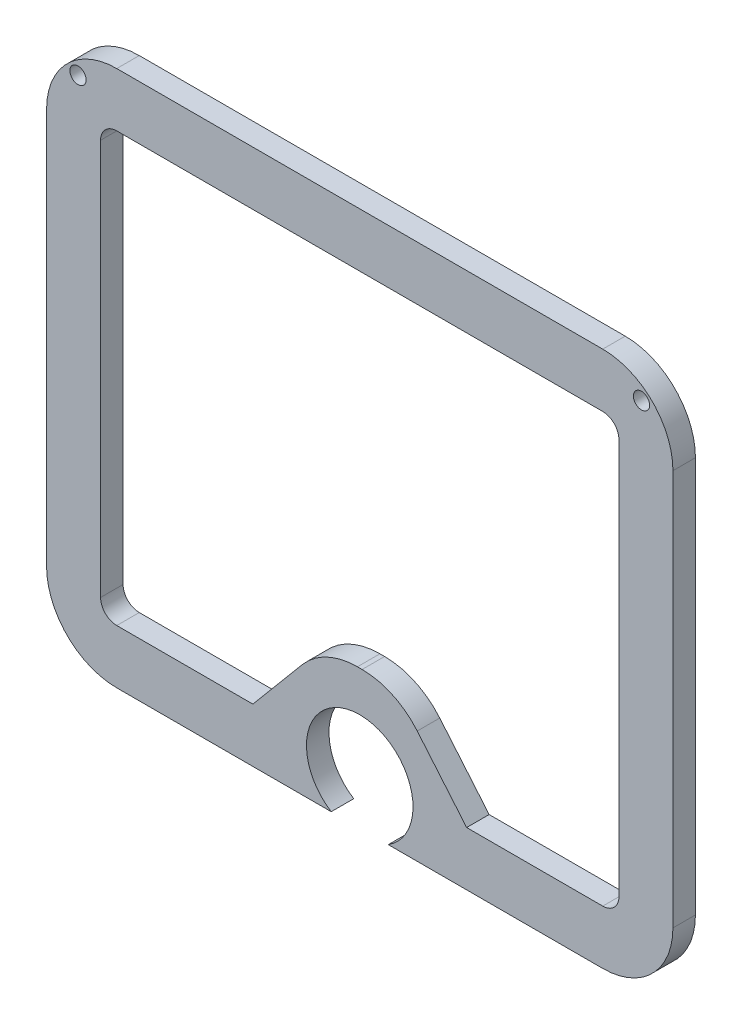
ISO-10303-21;
HEADER;
FILE_DESCRIPTION(('STEP AP214'),'2;1');
FILE_NAME('part.step','',(''),(''),'','','');
FILE_SCHEMA(('AUTOMOTIVE_DESIGN { 1 0 10303 214 1 1 1 1 }'));
ENDSEC;
DATA;
#1=APPLICATION_CONTEXT('core data for automotive mechanical design processes');
#2=APPLICATION_PROTOCOL_DEFINITION('international standard','automotive_design',2000,#1);
#3=PRODUCT_CONTEXT('',#1,'mechanical');
#4=PRODUCT('Part','Part','',(#3));
#5=PRODUCT_RELATED_PRODUCT_CATEGORY('part','',(#4));
#6=PRODUCT_DEFINITION_FORMATION('','',#4);
#7=PRODUCT_DEFINITION_CONTEXT('part definition',#1,'design');
#8=PRODUCT_DEFINITION('design','',#6,#7);
#9=PRODUCT_DEFINITION_SHAPE('','',#8);
#10=(LENGTH_UNIT() NAMED_UNIT(*) SI_UNIT(.MILLI.,.METRE.));
#11=(NAMED_UNIT(*) PLANE_ANGLE_UNIT() SI_UNIT($,.RADIAN.));
#12=(NAMED_UNIT(*) SI_UNIT($,.STERADIAN.) SOLID_ANGLE_UNIT());
#13=UNCERTAINTY_MEASURE_WITH_UNIT(LENGTH_MEASURE(1.E-05),#10,'distance_accuracy_value','');
#14=(GEOMETRIC_REPRESENTATION_CONTEXT(3) GLOBAL_UNCERTAINTY_ASSIGNED_CONTEXT((#13)) GLOBAL_UNIT_ASSIGNED_CONTEXT((#10,
#11,#12)) REPRESENTATION_CONTEXT('',''));
#15=CARTESIAN_POINT('',(0.,0.,0.));
#16=DIRECTION('',(0.,0.,1.));
#17=DIRECTION('',(1.,0.,0.));
#18=AXIS2_PLACEMENT_3D('',#15,#16,#17);
#19=CARTESIAN_POINT('',(0.,-15.748,1.5875));
#20=DIRECTION('',(0.,0.,1.));
#21=DIRECTION('',(1.,0.,0.));
#22=AXIS2_PLACEMENT_3D('',#19,#20,#21);
#23=PLANE('',#22);
#24=CARTESIAN_POINT('',(19.8808295195449,17.1448571369412,1.5875));
#25=DIRECTION('',(0.,0.,1.));
#26=DIRECTION('',(-1.,0.,0.));
#27=AXIS2_PLACEMENT_3D('',#24,#25,#26);
#28=CIRCLE('',#27,0.571499999999999);
#29=CARTESIAN_POINT('',(19.3093295195449,17.1448571369412,1.5875));
#30=VERTEX_POINT('',#29);
#31=EDGE_CURVE('E299',#30,#30,#28,.T.);
#32=ORIENTED_EDGE('',*,*,#31,.F.);
#33=EDGE_LOOP('',(#32));
#34=FACE_BOUND('',#33,.T.);
#35=CARTESIAN_POINT('',(0.,-15.748,1.5875));
#36=DIRECTION('',(0.,0.,-1.));
#37=DIRECTION('',(1.,0.,0.));
#38=AXIS2_PLACEMENT_3D('',#35,#36,#37);
#39=CIRCLE('',#38,3.7592);
#40=CARTESIAN_POINT('',(-2.01269959010282,-18.923,1.5875));
#41=VERTEX_POINT('',#40);
#42=CARTESIAN_POINT('',(2.01269959010283,-18.923,1.5875));
#43=VERTEX_POINT('',#42);
#44=EDGE_CURVE('E311',#41,#43,#39,.T.);
#45=ORIENTED_EDGE('',*,*,#44,.T.);
#46=DIRECTION('',(1.,0.,0.));
#47=VECTOR('',#46,1.);
#48=CARTESIAN_POINT('',(2.01269959010283,-18.923,1.5875));
#49=LINE('',#48,#47);
#50=CARTESIAN_POINT('',(17.145,-18.923,1.5875));
#51=VERTEX_POINT('',#50);
#52=EDGE_CURVE('E314',#43,#51,#49,.T.);
#53=ORIENTED_EDGE('',*,*,#52,.T.);
#54=CARTESIAN_POINT('',(17.145,-13.97,1.5875));
#55=DIRECTION('',(0.,0.,1.));
#56=DIRECTION('',(-1.,0.,0.));
#57=AXIS2_PLACEMENT_3D('',#54,#55,#56);
#58=CIRCLE('',#57,4.953);
#59=CARTESIAN_POINT('',(22.098,-13.97,1.5875));
#60=VERTEX_POINT('',#59);
#61=EDGE_CURVE('E317',#51,#60,#58,.T.);
#62=ORIENTED_EDGE('',*,*,#61,.T.);
#63=DIRECTION('',(0.,1.,0.));
#64=VECTOR('',#63,1.);
#65=CARTESIAN_POINT('',(22.098,13.97,1.5875));
#66=LINE('',#65,#64);
#67=CARTESIAN_POINT('',(22.098,13.97,1.5875));
#68=VERTEX_POINT('',#67);
#69=EDGE_CURVE('E319',#60,#68,#66,.T.);
#70=ORIENTED_EDGE('',*,*,#69,.T.);
#71=CARTESIAN_POINT('',(17.145,13.97,1.5875));
#72=DIRECTION('',(0.,0.,1.));
#73=DIRECTION('',(-1.,0.,0.));
#74=AXIS2_PLACEMENT_3D('',#71,#72,#73);
#75=CIRCLE('',#74,4.953);
#76=CARTESIAN_POINT('',(17.145,18.923,1.5875));
#77=VERTEX_POINT('',#76);
#78=EDGE_CURVE('E321',#68,#77,#75,.T.);
#79=ORIENTED_EDGE('',*,*,#78,.T.);
#80=DIRECTION('',(-1.,0.,0.));
#81=VECTOR('',#80,1.);
#82=CARTESIAN_POINT('',(17.145,18.923,1.5875));
#83=LINE('',#82,#81);
#84=CARTESIAN_POINT('',(-17.145,18.923,1.5875));
#85=VERTEX_POINT('',#84);
#86=EDGE_CURVE('E323',#77,#85,#83,.T.);
#87=ORIENTED_EDGE('',*,*,#86,.T.);
#88=CARTESIAN_POINT('',(-17.145,13.97,1.5875));
#89=DIRECTION('',(0.,0.,1.));
#90=DIRECTION('',(1.,0.,0.));
#91=AXIS2_PLACEMENT_3D('',#88,#89,#90);
#92=CIRCLE('',#91,4.953);
#93=CARTESIAN_POINT('',(-22.098,13.97,1.5875));
#94=VERTEX_POINT('',#93);
#95=EDGE_CURVE('E325',#85,#94,#92,.T.);
#96=ORIENTED_EDGE('',*,*,#95,.T.);
#97=DIRECTION('',(0.,-1.,0.));
#98=VECTOR('',#97,1.);
#99=CARTESIAN_POINT('',(-22.098,13.97,1.5875));
#100=LINE('',#99,#98);
#101=CARTESIAN_POINT('',(-22.098,-13.97,1.5875));
#102=VERTEX_POINT('',#101);
#103=EDGE_CURVE('E327',#94,#102,#100,.T.);
#104=ORIENTED_EDGE('',*,*,#103,.T.);
#105=CARTESIAN_POINT('',(-17.145,-13.97,1.5875));
#106=DIRECTION('',(0.,0.,1.));
#107=DIRECTION('',(-1.,0.,0.));
#108=AXIS2_PLACEMENT_3D('',#105,#106,#107);
#109=CIRCLE('',#108,4.953);
#110=CARTESIAN_POINT('',(-17.145,-18.923,1.5875));
#111=VERTEX_POINT('',#110);
#112=EDGE_CURVE('E329',#102,#111,#109,.T.);
#113=ORIENTED_EDGE('',*,*,#112,.T.);
#114=DIRECTION('',(1.,0.,0.));
#115=VECTOR('',#114,1.);
#116=CARTESIAN_POINT('',(-17.145,-18.923,1.5875));
#117=LINE('',#116,#115);
#118=EDGE_CURVE('E331',#111,#41,#117,.T.);
#119=ORIENTED_EDGE('',*,*,#118,.T.);
#120=EDGE_LOOP('',(#45,#53,#62,#70,#79,#87,#96,#104,#113,#119));
#121=FACE_BOUND('',#120,.T.);
#122=CARTESIAN_POINT('',(-19.8808295195449,17.1448571369412,1.5875));
#123=DIRECTION('',(0.,0.,1.));
#124=DIRECTION('',(1.,0.,0.));
#125=AXIS2_PLACEMENT_3D('',#122,#123,#124);
#126=CIRCLE('',#125,0.571499999999999);
#127=CARTESIAN_POINT('',(-19.3093295195449,17.1448571369412,1.5875));
#128=VERTEX_POINT('',#127);
#129=EDGE_CURVE('E305',#128,#128,#126,.T.);
#130=ORIENTED_EDGE('',*,*,#129,.F.);
#131=EDGE_LOOP('',(#130));
#132=FACE_BOUND('',#131,.T.);
#133=DIRECTION('',(0.,-1.,0.));
#134=VECTOR('',#133,1.);
#135=CARTESIAN_POINT('',(-18.288,13.97,1.5875));
#136=LINE('',#135,#134);
#137=CARTESIAN_POINT('',(-18.288,13.97,1.5875));
#138=VERTEX_POINT('',#137);
#139=CARTESIAN_POINT('',(-18.288,-13.97,1.5875));
#140=VERTEX_POINT('',#139);
#141=EDGE_CURVE('E200',#138,#140,#136,.T.);
#142=ORIENTED_EDGE('',*,*,#141,.F.);
#143=CARTESIAN_POINT('',(-17.145,13.97,1.5875));
#144=DIRECTION('',(0.,0.,1.));
#145=DIRECTION('',(1.,0.,0.));
#146=AXIS2_PLACEMENT_3D('',#143,#144,#145);
#147=CIRCLE('',#146,1.143);
#148=CARTESIAN_POINT('',(-17.145,15.113,1.5875));
#149=VERTEX_POINT('',#148);
#150=EDGE_CURVE('E192',#149,#138,#147,.T.);
#151=ORIENTED_EDGE('',*,*,#150,.F.);
#152=DIRECTION('',(-1.,0.,0.));
#153=VECTOR('',#152,1.);
#154=CARTESIAN_POINT('',(17.145,15.113,1.5875));
#155=LINE('',#154,#153);
#156=CARTESIAN_POINT('',(17.145,15.113,1.5875));
#157=VERTEX_POINT('',#156);
#158=EDGE_CURVE('E237',#157,#149,#155,.T.);
#159=ORIENTED_EDGE('',*,*,#158,.F.);
#160=CARTESIAN_POINT('',(17.145,13.97,1.5875));
#161=DIRECTION('',(0.,0.,1.));
#162=DIRECTION('',(-1.,0.,0.));
#163=AXIS2_PLACEMENT_3D('',#160,#161,#162);
#164=CIRCLE('',#163,1.143);
#165=CARTESIAN_POINT('',(18.288,13.97,1.5875));
#166=VERTEX_POINT('',#165);
#167=EDGE_CURVE('E235',#166,#157,#164,.T.);
#168=ORIENTED_EDGE('',*,*,#167,.F.);
#169=DIRECTION('',(0.,1.,0.));
#170=VECTOR('',#169,1.);
#171=CARTESIAN_POINT('',(18.288,13.97,1.5875));
#172=LINE('',#171,#170);
#173=CARTESIAN_POINT('',(18.288,-13.97,1.5875));
#174=VERTEX_POINT('',#173);
#175=EDGE_CURVE('E233',#174,#166,#172,.T.);
#176=ORIENTED_EDGE('',*,*,#175,.F.);
#177=CARTESIAN_POINT('',(17.145,-13.97,1.5875));
#178=DIRECTION('',(0.,0.,1.));
#179=DIRECTION('',(-1.,0.,0.));
#180=AXIS2_PLACEMENT_3D('',#177,#178,#179);
#181=CIRCLE('',#180,1.143);
#182=CARTESIAN_POINT('',(17.145,-15.113,1.5875));
#183=VERTEX_POINT('',#182);
#184=EDGE_CURVE('E231',#183,#174,#181,.T.);
#185=ORIENTED_EDGE('',*,*,#184,.F.);
#186=DIRECTION('',(1.,0.,0.));
#187=VECTOR('',#186,1.);
#188=CARTESIAN_POINT('',(7.54251706262571,-15.113,1.5875));
#189=LINE('',#188,#187);
#190=CARTESIAN_POINT('',(7.54251706262571,-15.113,1.5875));
#191=VERTEX_POINT('',#190);
#192=EDGE_CURVE('E229',#191,#183,#189,.T.);
#193=ORIENTED_EDGE('',*,*,#192,.F.);
#194=DIRECTION('',(0.642787609686538,-0.766044443118979,0.));
#195=VECTOR('',#194,1.);
#196=CARTESIAN_POINT('',(7.54251706262571,-15.113,1.5875));
#197=LINE('',#196,#195);
#198=CARTESIAN_POINT('',(4.05659423174559,-10.9586389427924,1.5875));
#199=VERTEX_POINT('',#198);
#200=EDGE_CURVE('E227',#199,#191,#197,.T.);
#201=ORIENTED_EDGE('',*,*,#200,.F.);
#202=CARTESIAN_POINT('',(0.165088460701164,-14.224,1.5875));
#203=DIRECTION('',(0.,0.,-1.));
#204=DIRECTION('',(-1.,0.,0.));
#205=AXIS2_PLACEMENT_3D('',#202,#203,#204);
#206=CIRCLE('',#205,5.08);
#207=CARTESIAN_POINT('',(0.165088460701142,-9.14400000000002,1.5875));
#208=VERTEX_POINT('',#207);
#209=EDGE_CURVE('E225',#208,#199,#206,.T.);
#210=ORIENTED_EDGE('',*,*,#209,.F.);
#211=DIRECTION('',(1.,0.,0.));
#212=VECTOR('',#211,1.);
#213=CARTESIAN_POINT('',(-0.165088460701134,-9.14400000000002,1.5875));
#214=LINE('',#213,#212);
#215=CARTESIAN_POINT('',(-0.165088460701135,-9.14400000000002,1.5875));
#216=VERTEX_POINT('',#215);
#217=EDGE_CURVE('E223',#216,#208,#214,.T.);
#218=ORIENTED_EDGE('',*,*,#217,.F.);
#219=CARTESIAN_POINT('',(-0.165088460701156,-14.224,1.5875));
#220=DIRECTION('',(0.,0.,-1.));
#221=DIRECTION('',(1.,0.,0.));
#222=AXIS2_PLACEMENT_3D('',#219,#220,#221);
#223=CIRCLE('',#222,5.08);
#224=CARTESIAN_POINT('',(-4.05659423174558,-10.9586389427924,1.5875));
#225=VERTEX_POINT('',#224);
#226=EDGE_CURVE('E221',#225,#216,#223,.T.);
#227=ORIENTED_EDGE('',*,*,#226,.F.);
#228=DIRECTION('',(0.642787609686538,0.766044443118979,0.));
#229=VECTOR('',#228,1.);
#230=CARTESIAN_POINT('',(-7.54251706262571,-15.113,1.5875));
#231=LINE('',#230,#229);
#232=CARTESIAN_POINT('',(-7.54251706262571,-15.113,1.5875));
#233=VERTEX_POINT('',#232);
#234=EDGE_CURVE('E219',#233,#225,#231,.T.);
#235=ORIENTED_EDGE('',*,*,#234,.F.);
#236=DIRECTION('',(1.,0.,0.));
#237=VECTOR('',#236,1.);
#238=CARTESIAN_POINT('',(-17.145,-15.113,1.5875));
#239=LINE('',#238,#237);
#240=CARTESIAN_POINT('',(-17.145,-15.113,1.5875));
#241=VERTEX_POINT('',#240);
#242=EDGE_CURVE('E215',#241,#233,#239,.T.);
#243=ORIENTED_EDGE('',*,*,#242,.F.);
#244=CARTESIAN_POINT('',(-17.145,-13.97,1.5875));
#245=DIRECTION('',(0.,0.,1.));
#246=DIRECTION('',(-1.,0.,0.));
#247=AXIS2_PLACEMENT_3D('',#244,#245,#246);
#248=CIRCLE('',#247,1.143);
#249=EDGE_CURVE('E213',#140,#241,#248,.T.);
#250=ORIENTED_EDGE('',*,*,#249,.F.);
#251=EDGE_LOOP('',(#142,#151,#159,#168,#176,#185,#193,#201,#210,#218,#227,#235,#243,#250));
#252=FACE_BOUND('',#251,.T.);
#253=ADVANCED_FACE('F31',(#34,#121,#132,#252),#23,.T.);
#254=CARTESIAN_POINT('',(0.,-15.748,0.));
#255=DIRECTION('',(0.,0.,1.));
#256=DIRECTION('',(1.,0.,0.));
#257=AXIS2_PLACEMENT_3D('',#254,#255,#256);
#258=PLANE('',#257);
#259=CARTESIAN_POINT('',(19.8808295195449,17.1448571369412,0.));
#260=DIRECTION('',(0.,0.,1.));
#261=DIRECTION('',(-1.,0.,0.));
#262=AXIS2_PLACEMENT_3D('',#259,#260,#261);
#263=CIRCLE('',#262,0.571499999999999);
#264=CARTESIAN_POINT('',(19.3093295195449,17.1448571369412,0.));
#265=VERTEX_POINT('',#264);
#266=EDGE_CURVE('E208',#265,#265,#263,.T.);
#267=ORIENTED_EDGE('',*,*,#266,.T.);
#268=EDGE_LOOP('',(#267));
#269=FACE_BOUND('',#268,.T.);
#270=CARTESIAN_POINT('',(0.,-15.748,0.));
#271=DIRECTION('',(0.,0.,-1.));
#272=DIRECTION('',(1.,0.,0.));
#273=AXIS2_PLACEMENT_3D('',#270,#271,#272);
#274=CIRCLE('',#273,3.7592);
#275=CARTESIAN_POINT('',(-2.01269959010282,-18.923,0.));
#276=VERTEX_POINT('',#275);
#277=CARTESIAN_POINT('',(2.01269959010283,-18.923,0.));
#278=VERTEX_POINT('',#277);
#279=EDGE_CURVE('E308',#276,#278,#274,.T.);
#280=ORIENTED_EDGE('',*,*,#279,.F.);
#281=DIRECTION('',(1.,0.,0.));
#282=VECTOR('',#281,1.);
#283=CARTESIAN_POINT('',(-17.145,-18.923,0.));
#284=LINE('',#283,#282);
#285=CARTESIAN_POINT('',(-17.145,-18.923,0.));
#286=VERTEX_POINT('',#285);
#287=EDGE_CURVE('E315',#286,#276,#284,.T.);
#288=ORIENTED_EDGE('',*,*,#287,.F.);
#289=CARTESIAN_POINT('',(-17.145,-13.97,0.));
#290=DIRECTION('',(0.,0.,1.));
#291=DIRECTION('',(-1.,0.,0.));
#292=AXIS2_PLACEMENT_3D('',#289,#290,#291);
#293=CIRCLE('',#292,4.953);
#294=CARTESIAN_POINT('',(-22.098,-13.97,0.));
#295=VERTEX_POINT('',#294);
#296=EDGE_CURVE('E350',#295,#286,#293,.T.);
#297=ORIENTED_EDGE('',*,*,#296,.F.);
#298=DIRECTION('',(0.,-1.,0.));
#299=VECTOR('',#298,1.);
#300=CARTESIAN_POINT('',(-22.098,13.97,0.));
#301=LINE('',#300,#299);
#302=CARTESIAN_POINT('',(-22.098,13.97,0.));
#303=VERTEX_POINT('',#302);
#304=EDGE_CURVE('E348',#303,#295,#301,.T.);
#305=ORIENTED_EDGE('',*,*,#304,.F.);
#306=CARTESIAN_POINT('',(-17.145,13.97,0.));
#307=DIRECTION('',(0.,0.,1.));
#308=DIRECTION('',(1.,0.,0.));
#309=AXIS2_PLACEMENT_3D('',#306,#307,#308);
#310=CIRCLE('',#309,4.953);
#311=CARTESIAN_POINT('',(-17.145,18.923,0.));
#312=VERTEX_POINT('',#311);
#313=EDGE_CURVE('E346',#312,#303,#310,.T.);
#314=ORIENTED_EDGE('',*,*,#313,.F.);
#315=DIRECTION('',(-1.,0.,0.));
#316=VECTOR('',#315,1.);
#317=CARTESIAN_POINT('',(17.145,18.923,0.));
#318=LINE('',#317,#316);
#319=CARTESIAN_POINT('',(17.145,18.923,0.));
#320=VERTEX_POINT('',#319);
#321=EDGE_CURVE('E344',#320,#312,#318,.T.);
#322=ORIENTED_EDGE('',*,*,#321,.F.);
#323=CARTESIAN_POINT('',(17.145,13.97,0.));
#324=DIRECTION('',(0.,0.,1.));
#325=DIRECTION('',(-1.,0.,0.));
#326=AXIS2_PLACEMENT_3D('',#323,#324,#325);
#327=CIRCLE('',#326,4.953);
#328=CARTESIAN_POINT('',(22.098,13.97,0.));
#329=VERTEX_POINT('',#328);
#330=EDGE_CURVE('E342',#329,#320,#327,.T.);
#331=ORIENTED_EDGE('',*,*,#330,.F.);
#332=DIRECTION('',(0.,1.,0.));
#333=VECTOR('',#332,1.);
#334=CARTESIAN_POINT('',(22.098,13.97,0.));
#335=LINE('',#334,#333);
#336=CARTESIAN_POINT('',(22.098,-13.97,0.));
#337=VERTEX_POINT('',#336);
#338=EDGE_CURVE('E340',#337,#329,#335,.T.);
#339=ORIENTED_EDGE('',*,*,#338,.F.);
#340=CARTESIAN_POINT('',(17.145,-13.97,0.));
#341=DIRECTION('',(0.,0.,1.));
#342=DIRECTION('',(-1.,0.,0.));
#343=AXIS2_PLACEMENT_3D('',#340,#341,#342);
#344=CIRCLE('',#343,4.953);
#345=CARTESIAN_POINT('',(17.145,-18.923,0.));
#346=VERTEX_POINT('',#345);
#347=EDGE_CURVE('E338',#346,#337,#344,.T.);
#348=ORIENTED_EDGE('',*,*,#347,.F.);
#349=DIRECTION('',(1.,0.,0.));
#350=VECTOR('',#349,1.);
#351=CARTESIAN_POINT('',(2.01269959010283,-18.923,0.));
#352=LINE('',#351,#350);
#353=EDGE_CURVE('E336',#278,#346,#352,.T.);
#354=ORIENTED_EDGE('',*,*,#353,.F.);
#355=EDGE_LOOP('',(#280,#288,#297,#305,#314,#322,#331,#339,#348,#354));
#356=FACE_BOUND('',#355,.T.);
#357=CARTESIAN_POINT('',(-19.8808295195449,17.1448571369412,0.));
#358=DIRECTION('',(0.,0.,1.));
#359=DIRECTION('',(1.,0.,0.));
#360=AXIS2_PLACEMENT_3D('',#357,#358,#359);
#361=CIRCLE('',#360,0.571499999999999);
#362=CARTESIAN_POINT('',(-19.3093295195449,17.1448571369412,0.));
#363=VERTEX_POINT('',#362);
#364=EDGE_CURVE('E302',#363,#363,#361,.T.);
#365=ORIENTED_EDGE('',*,*,#364,.T.);
#366=EDGE_LOOP('',(#365));
#367=FACE_BOUND('',#366,.T.);
#368=CARTESIAN_POINT('',(-17.145,13.97,0.));
#369=DIRECTION('',(0.,0.,1.));
#370=DIRECTION('',(1.,0.,0.));
#371=AXIS2_PLACEMENT_3D('',#368,#369,#370);
#372=CIRCLE('',#371,1.143);
#373=CARTESIAN_POINT('',(-17.145,15.113,0.));
#374=VERTEX_POINT('',#373);
#375=CARTESIAN_POINT('',(-18.288,13.97,0.));
#376=VERTEX_POINT('',#375);
#377=EDGE_CURVE('E54',#374,#376,#372,.T.);
#378=ORIENTED_EDGE('',*,*,#377,.T.);
#379=DIRECTION('',(0.,-1.,0.));
#380=VECTOR('',#379,1.);
#381=CARTESIAN_POINT('',(-18.288,13.97,0.));
#382=LINE('',#381,#380);
#383=CARTESIAN_POINT('',(-18.288,-13.97,0.));
#384=VERTEX_POINT('',#383);
#385=EDGE_CURVE('E207',#376,#384,#382,.T.);
#386=ORIENTED_EDGE('',*,*,#385,.T.);
#387=CARTESIAN_POINT('',(-17.145,-13.97,0.));
#388=DIRECTION('',(0.,0.,1.));
#389=DIRECTION('',(-1.,0.,0.));
#390=AXIS2_PLACEMENT_3D('',#387,#388,#389);
#391=CIRCLE('',#390,1.143);
#392=CARTESIAN_POINT('',(-17.145,-15.113,0.));
#393=VERTEX_POINT('',#392);
#394=EDGE_CURVE('E241',#384,#393,#391,.T.);
#395=ORIENTED_EDGE('',*,*,#394,.T.);
#396=DIRECTION('',(1.,0.,0.));
#397=VECTOR('',#396,1.);
#398=CARTESIAN_POINT('',(-17.145,-15.113,0.));
#399=LINE('',#398,#397);
#400=CARTESIAN_POINT('',(-7.54251706262571,-15.113,0.));
#401=VERTEX_POINT('',#400);
#402=EDGE_CURVE('E244',#393,#401,#399,.T.);
#403=ORIENTED_EDGE('',*,*,#402,.T.);
#404=DIRECTION('',(0.642787609686538,0.766044443118979,0.));
#405=VECTOR('',#404,1.);
#406=CARTESIAN_POINT('',(-7.54251706262571,-15.113,0.));
#407=LINE('',#406,#405);
#408=CARTESIAN_POINT('',(-4.05659423174558,-10.9586389427924,0.));
#409=VERTEX_POINT('',#408);
#410=EDGE_CURVE('E247',#401,#409,#407,.T.);
#411=ORIENTED_EDGE('',*,*,#410,.T.);
#412=CARTESIAN_POINT('',(-0.165088460701156,-14.224,0.));
#413=DIRECTION('',(0.,0.,-1.));
#414=DIRECTION('',(1.,0.,0.));
#415=AXIS2_PLACEMENT_3D('',#412,#413,#414);
#416=CIRCLE('',#415,5.08);
#417=CARTESIAN_POINT('',(-0.165088460701135,-9.14400000000002,0.));
#418=VERTEX_POINT('',#417);
#419=EDGE_CURVE('E250',#409,#418,#416,.T.);
#420=ORIENTED_EDGE('',*,*,#419,.T.);
#421=DIRECTION('',(1.,0.,0.));
#422=VECTOR('',#421,1.);
#423=CARTESIAN_POINT('',(-0.165088460701134,-9.14400000000002,0.));
#424=LINE('',#423,#422);
#425=CARTESIAN_POINT('',(0.165088460701142,-9.14400000000002,0.));
#426=VERTEX_POINT('',#425);
#427=EDGE_CURVE('E253',#418,#426,#424,.T.);
#428=ORIENTED_EDGE('',*,*,#427,.T.);
#429=CARTESIAN_POINT('',(0.165088460701164,-14.224,0.));
#430=DIRECTION('',(0.,0.,-1.));
#431=DIRECTION('',(-1.,0.,0.));
#432=AXIS2_PLACEMENT_3D('',#429,#430,#431);
#433=CIRCLE('',#432,5.08);
#434=CARTESIAN_POINT('',(4.05659423174559,-10.9586389427924,0.));
#435=VERTEX_POINT('',#434);
#436=EDGE_CURVE('E256',#426,#435,#433,.T.);
#437=ORIENTED_EDGE('',*,*,#436,.T.);
#438=DIRECTION('',(0.642787609686538,-0.766044443118979,0.));
#439=VECTOR('',#438,1.);
#440=CARTESIAN_POINT('',(7.54251706262571,-15.113,0.));
#441=LINE('',#440,#439);
#442=CARTESIAN_POINT('',(7.54251706262571,-15.113,0.));
#443=VERTEX_POINT('',#442);
#444=EDGE_CURVE('E259',#435,#443,#441,.T.);
#445=ORIENTED_EDGE('',*,*,#444,.T.);
#446=DIRECTION('',(1.,0.,0.));
#447=VECTOR('',#446,1.);
#448=CARTESIAN_POINT('',(7.54251706262571,-15.113,0.));
#449=LINE('',#448,#447);
#450=CARTESIAN_POINT('',(17.145,-15.113,0.));
#451=VERTEX_POINT('',#450);
#452=EDGE_CURVE('E262',#443,#451,#449,.T.);
#453=ORIENTED_EDGE('',*,*,#452,.T.);
#454=CARTESIAN_POINT('',(17.145,-13.97,0.));
#455=DIRECTION('',(0.,0.,1.));
#456=DIRECTION('',(-1.,0.,0.));
#457=AXIS2_PLACEMENT_3D('',#454,#455,#456);
#458=CIRCLE('',#457,1.143);
#459=CARTESIAN_POINT('',(18.288,-13.97,0.));
#460=VERTEX_POINT('',#459);
#461=EDGE_CURVE('E265',#451,#460,#458,.T.);
#462=ORIENTED_EDGE('',*,*,#461,.T.);
#463=DIRECTION('',(0.,1.,0.));
#464=VECTOR('',#463,1.);
#465=CARTESIAN_POINT('',(18.288,13.97,0.));
#466=LINE('',#465,#464);
#467=CARTESIAN_POINT('',(18.288,13.97,0.));
#468=VERTEX_POINT('',#467);
#469=EDGE_CURVE('E268',#460,#468,#466,.T.);
#470=ORIENTED_EDGE('',*,*,#469,.T.);
#471=CARTESIAN_POINT('',(17.145,13.97,0.));
#472=DIRECTION('',(0.,0.,1.));
#473=DIRECTION('',(-1.,0.,0.));
#474=AXIS2_PLACEMENT_3D('',#471,#472,#473);
#475=CIRCLE('',#474,1.143);
#476=CARTESIAN_POINT('',(17.145,15.113,0.));
#477=VERTEX_POINT('',#476);
#478=EDGE_CURVE('E271',#468,#477,#475,.T.);
#479=ORIENTED_EDGE('',*,*,#478,.T.);
#480=DIRECTION('',(-1.,0.,0.));
#481=VECTOR('',#480,1.);
#482=CARTESIAN_POINT('',(17.145,15.113,0.));
#483=LINE('',#482,#481);
#484=EDGE_CURVE('E201',#477,#374,#483,.T.);
#485=ORIENTED_EDGE('',*,*,#484,.T.);
#486=EDGE_LOOP('',(#378,#386,#395,#403,#411,#420,#428,#437,#445,#453,#462,#470,#479,#485));
#487=FACE_BOUND('',#486,.T.);
#488=ADVANCED_FACE('F386',(#269,#356,#367,#487),#258,.F.);
#489=CARTESIAN_POINT('',(0.,-15.748,1.5875));
#490=DIRECTION('',(0.,0.,-1.));
#491=DIRECTION('',(-1.,0.,0.));
#492=AXIS2_PLACEMENT_3D('',#489,#490,#491);
#493=CYLINDRICAL_SURFACE('',#492,3.7592);
#494=ORIENTED_EDGE('',*,*,#279,.T.);
#495=DIRECTION('',(0.,0.,-1.));
#496=VECTOR('',#495,1.);
#497=CARTESIAN_POINT('',(2.01269959010283,-18.923,1.5875));
#498=LINE('',#497,#496);
#499=EDGE_CURVE('E11',#43,#278,#498,.T.);
#500=ORIENTED_EDGE('',*,*,#499,.F.);
#501=ORIENTED_EDGE('',*,*,#44,.F.);
#502=DIRECTION('',(0.,0.,-1.));
#503=VECTOR('',#502,1.);
#504=CARTESIAN_POINT('',(-2.01269959010282,-18.923,1.5875));
#505=LINE('',#504,#503);
#506=EDGE_CURVE('E333',#41,#276,#505,.T.);
#507=ORIENTED_EDGE('',*,*,#506,.T.);
#508=EDGE_LOOP('',(#494,#500,#501,#507));
#509=FACE_BOUND('',#508,.T.);
#510=ADVANCED_FACE('F33',(#509),#493,.F.);
#511=CARTESIAN_POINT('',(2.01269959010283,-18.923,1.5875));
#512=DIRECTION('',(0.,1.,0.));
#513=DIRECTION('',(0.,0.,1.));
#514=AXIS2_PLACEMENT_3D('',#511,#512,#513);
#515=PLANE('',#514);
#516=ORIENTED_EDGE('',*,*,#353,.T.);
#517=DIRECTION('',(0.,0.,-1.));
#518=VECTOR('',#517,1.);
#519=CARTESIAN_POINT('',(17.145,-18.923,1.5875));
#520=LINE('',#519,#518);
#521=EDGE_CURVE('E39',#51,#346,#520,.T.);
#522=ORIENTED_EDGE('',*,*,#521,.F.);
#523=ORIENTED_EDGE('',*,*,#52,.F.);
#524=ORIENTED_EDGE('',*,*,#499,.T.);
#525=EDGE_LOOP('',(#516,#522,#523,#524));
#526=FACE_BOUND('',#525,.T.);
#527=ADVANCED_FACE('F404',(#526),#515,.F.);
#528=CARTESIAN_POINT('',(17.145,-13.97,1.5875));
#529=DIRECTION('',(0.,0.,-1.));
#530=DIRECTION('',(-1.,0.,0.));
#531=AXIS2_PLACEMENT_3D('',#528,#529,#530);
#532=CYLINDRICAL_SURFACE('',#531,4.953);
#533=ORIENTED_EDGE('',*,*,#347,.T.);
#534=DIRECTION('',(0.,0.,-1.));
#535=VECTOR('',#534,1.);
#536=CARTESIAN_POINT('',(22.098,-13.97,1.5875));
#537=LINE('',#536,#535);
#538=EDGE_CURVE('E373',#60,#337,#537,.T.);
#539=ORIENTED_EDGE('',*,*,#538,.F.);
#540=ORIENTED_EDGE('',*,*,#61,.F.);
#541=ORIENTED_EDGE('',*,*,#521,.T.);
#542=EDGE_LOOP('',(#533,#539,#540,#541));
#543=FACE_BOUND('',#542,.T.);
#544=ADVANCED_FACE('F380',(#543),#532,.T.);
#545=CARTESIAN_POINT('',(22.098,13.97,1.5875));
#546=DIRECTION('',(-1.,0.,0.));
#547=DIRECTION('',(0.,-1.,0.));
#548=AXIS2_PLACEMENT_3D('',#545,#546,#547);
#549=PLANE('',#548);
#550=ORIENTED_EDGE('',*,*,#338,.T.);
#551=DIRECTION('',(0.,0.,-1.));
#552=VECTOR('',#551,1.);
#553=CARTESIAN_POINT('',(22.098,13.97,1.5875));
#554=LINE('',#553,#552);
#555=EDGE_CURVE('E370',#68,#329,#554,.T.);
#556=ORIENTED_EDGE('',*,*,#555,.F.);
#557=ORIENTED_EDGE('',*,*,#69,.F.);
#558=ORIENTED_EDGE('',*,*,#538,.T.);
#559=EDGE_LOOP('',(#550,#556,#557,#558));
#560=FACE_BOUND('',#559,.T.);
#561=ADVANCED_FACE('F392',(#560),#549,.F.);
#562=CARTESIAN_POINT('',(17.145,13.97,1.5875));
#563=DIRECTION('',(0.,0.,-1.));
#564=DIRECTION('',(-1.,0.,0.));
#565=AXIS2_PLACEMENT_3D('',#562,#563,#564);
#566=CYLINDRICAL_SURFACE('',#565,4.953);
#567=ORIENTED_EDGE('',*,*,#330,.T.);
#568=DIRECTION('',(0.,0.,-1.));
#569=VECTOR('',#568,1.);
#570=CARTESIAN_POINT('',(17.145,18.923,1.5875));
#571=LINE('',#570,#569);
#572=EDGE_CURVE('E367',#77,#320,#571,.T.);
#573=ORIENTED_EDGE('',*,*,#572,.F.);
#574=ORIENTED_EDGE('',*,*,#78,.F.);
#575=ORIENTED_EDGE('',*,*,#555,.T.);
#576=EDGE_LOOP('',(#567,#573,#574,#575));
#577=FACE_BOUND('',#576,.T.);
#578=ADVANCED_FACE('F396',(#577),#566,.T.);
#579=CARTESIAN_POINT('',(17.145,18.923,1.5875));
#580=DIRECTION('',(0.,-1.,0.));
#581=DIRECTION('',(1.,0.,0.));
#582=AXIS2_PLACEMENT_3D('',#579,#580,#581);
#583=PLANE('',#582);
#584=ORIENTED_EDGE('',*,*,#321,.T.);
#585=DIRECTION('',(0.,0.,-1.));
#586=VECTOR('',#585,1.);
#587=CARTESIAN_POINT('',(-17.145,18.923,1.5875));
#588=LINE('',#587,#586);
#589=EDGE_CURVE('E364',#85,#312,#588,.T.);
#590=ORIENTED_EDGE('',*,*,#589,.F.);
#591=ORIENTED_EDGE('',*,*,#86,.F.);
#592=ORIENTED_EDGE('',*,*,#572,.T.);
#593=EDGE_LOOP('',(#584,#590,#591,#592));
#594=FACE_BOUND('',#593,.T.);
#595=ADVANCED_FACE('F427',(#594),#583,.F.);
#596=CARTESIAN_POINT('',(-17.145,13.97,1.5875));
#597=DIRECTION('',(0.,0.,-1.));
#598=DIRECTION('',(-1.,0.,0.));
#599=AXIS2_PLACEMENT_3D('',#596,#597,#598);
#600=CYLINDRICAL_SURFACE('',#599,4.953);
#601=ORIENTED_EDGE('',*,*,#313,.T.);
#602=DIRECTION('',(0.,0.,-1.));
#603=VECTOR('',#602,1.);
#604=CARTESIAN_POINT('',(-22.098,13.97,1.5875));
#605=LINE('',#604,#603);
#606=EDGE_CURVE('E361',#94,#303,#605,.T.);
#607=ORIENTED_EDGE('',*,*,#606,.F.);
#608=ORIENTED_EDGE('',*,*,#95,.F.);
#609=ORIENTED_EDGE('',*,*,#589,.T.);
#610=EDGE_LOOP('',(#601,#607,#608,#609));
#611=FACE_BOUND('',#610,.T.);
#612=ADVANCED_FACE('F424',(#611),#600,.T.);
#613=CARTESIAN_POINT('',(-22.098,13.97,1.5875));
#614=DIRECTION('',(1.,0.,0.));
#615=DIRECTION('',(0.,1.,0.));
#616=AXIS2_PLACEMENT_3D('',#613,#614,#615);
#617=PLANE('',#616);
#618=ORIENTED_EDGE('',*,*,#304,.T.);
#619=DIRECTION('',(0.,0.,-1.));
#620=VECTOR('',#619,1.);
#621=CARTESIAN_POINT('',(-22.098,-13.97,1.5875));
#622=LINE('',#621,#620);
#623=EDGE_CURVE('E358',#102,#295,#622,.T.);
#624=ORIENTED_EDGE('',*,*,#623,.F.);
#625=ORIENTED_EDGE('',*,*,#103,.F.);
#626=ORIENTED_EDGE('',*,*,#606,.T.);
#627=EDGE_LOOP('',(#618,#624,#625,#626));
#628=FACE_BOUND('',#627,.T.);
#629=ADVANCED_FACE('F420',(#628),#617,.F.);
#630=CARTESIAN_POINT('',(-17.145,-13.97,1.5875));
#631=DIRECTION('',(0.,0.,-1.));
#632=DIRECTION('',(-1.,0.,0.));
#633=AXIS2_PLACEMENT_3D('',#630,#631,#632);
#634=CYLINDRICAL_SURFACE('',#633,4.953);
#635=ORIENTED_EDGE('',*,*,#296,.T.);
#636=DIRECTION('',(0.,0.,-1.));
#637=VECTOR('',#636,1.);
#638=CARTESIAN_POINT('',(-17.145,-18.923,1.5875));
#639=LINE('',#638,#637);
#640=EDGE_CURVE('E355',#111,#286,#639,.T.);
#641=ORIENTED_EDGE('',*,*,#640,.F.);
#642=ORIENTED_EDGE('',*,*,#112,.F.);
#643=ORIENTED_EDGE('',*,*,#623,.T.);
#644=EDGE_LOOP('',(#635,#641,#642,#643));
#645=FACE_BOUND('',#644,.T.);
#646=ADVANCED_FACE('F416',(#645),#634,.T.);
#647=CARTESIAN_POINT('',(-17.145,-18.923,1.5875));
#648=DIRECTION('',(0.,1.,0.));
#649=DIRECTION('',(-1.,0.,0.));
#650=AXIS2_PLACEMENT_3D('',#647,#648,#649);
#651=PLANE('',#650);
#652=ORIENTED_EDGE('',*,*,#287,.T.);
#653=ORIENTED_EDGE('',*,*,#506,.F.);
#654=ORIENTED_EDGE('',*,*,#118,.F.);
#655=ORIENTED_EDGE('',*,*,#640,.T.);
#656=EDGE_LOOP('',(#652,#653,#654,#655));
#657=FACE_BOUND('',#656,.T.);
#658=ADVANCED_FACE('F411',(#657),#651,.F.);
#659=CARTESIAN_POINT('',(-19.8808295195449,17.1448571369412,1.5875));
#660=DIRECTION('',(0.,0.,-1.));
#661=DIRECTION('',(-1.,0.,0.));
#662=AXIS2_PLACEMENT_3D('',#659,#660,#661);
#663=CYLINDRICAL_SURFACE('',#662,0.571499999999999);
#664=ORIENTED_EDGE('',*,*,#129,.T.);
#665=EDGE_LOOP('',(#664));
#666=FACE_BOUND('',#665,.T.);
#667=ORIENTED_EDGE('',*,*,#364,.F.);
#668=EDGE_LOOP('',(#667));
#669=FACE_BOUND('',#668,.T.);
#670=ADVANCED_FACE('F446',(#666,#669),#663,.F.);
#671=CARTESIAN_POINT('',(19.8808295195449,17.1448571369412,1.5875));
#672=DIRECTION('',(0.,0.,-1.));
#673=DIRECTION('',(-1.,0.,0.));
#674=AXIS2_PLACEMENT_3D('',#671,#672,#673);
#675=CYLINDRICAL_SURFACE('',#674,0.571499999999999);
#676=ORIENTED_EDGE('',*,*,#31,.T.);
#677=EDGE_LOOP('',(#676));
#678=FACE_BOUND('',#677,.T.);
#679=ORIENTED_EDGE('',*,*,#266,.F.);
#680=EDGE_LOOP('',(#679));
#681=FACE_BOUND('',#680,.T.);
#682=ADVANCED_FACE('F472',(#678,#681),#675,.F.);
#683=CARTESIAN_POINT('',(-17.145,13.97,1.5875));
#684=DIRECTION('',(0.,0.,-1.));
#685=DIRECTION('',(-1.,0.,0.));
#686=AXIS2_PLACEMENT_3D('',#683,#684,#685);
#687=CYLINDRICAL_SURFACE('',#686,1.143);
#688=ORIENTED_EDGE('',*,*,#377,.F.);
#689=DIRECTION('',(0.,0.,-1.));
#690=VECTOR('',#689,1.);
#691=CARTESIAN_POINT('',(-17.145,15.113,1.5875));
#692=LINE('',#691,#690);
#693=EDGE_CURVE('E196',#149,#374,#692,.T.);
#694=ORIENTED_EDGE('',*,*,#693,.F.);
#695=ORIENTED_EDGE('',*,*,#150,.T.);
#696=DIRECTION('',(0.,0.,-1.));
#697=VECTOR('',#696,1.);
#698=CARTESIAN_POINT('',(-18.288,13.97,1.5875));
#699=LINE('',#698,#697);
#700=EDGE_CURVE('E195',#138,#376,#699,.T.);
#701=ORIENTED_EDGE('',*,*,#700,.T.);
#702=EDGE_LOOP('',(#688,#694,#695,#701));
#703=FACE_BOUND('',#702,.T.);
#704=ADVANCED_FACE('F194',(#703),#687,.F.);
#705=CARTESIAN_POINT('',(-18.288,13.97,1.5875));
#706=DIRECTION('',(1.,0.,0.));
#707=DIRECTION('',(0.,0.,-1.));
#708=AXIS2_PLACEMENT_3D('',#705,#706,#707);
#709=PLANE('',#708);
#710=ORIENTED_EDGE('',*,*,#385,.F.);
#711=ORIENTED_EDGE('',*,*,#700,.F.);
#712=ORIENTED_EDGE('',*,*,#141,.T.);
#713=DIRECTION('',(0.,0.,-1.));
#714=VECTOR('',#713,1.);
#715=CARTESIAN_POINT('',(-18.288,-13.97,1.5875));
#716=LINE('',#715,#714);
#717=EDGE_CURVE('E209',#140,#384,#716,.T.);
#718=ORIENTED_EDGE('',*,*,#717,.T.);
#719=EDGE_LOOP('',(#710,#711,#712,#718));
#720=FACE_BOUND('',#719,.T.);
#721=ADVANCED_FACE('F204',(#720),#709,.T.);
#722=CARTESIAN_POINT('',(-17.145,-13.97,1.5875));
#723=DIRECTION('',(0.,0.,-1.));
#724=DIRECTION('',(-1.,0.,0.));
#725=AXIS2_PLACEMENT_3D('',#722,#723,#724);
#726=CYLINDRICAL_SURFACE('',#725,1.143);
#727=ORIENTED_EDGE('',*,*,#394,.F.);
#728=ORIENTED_EDGE('',*,*,#717,.F.);
#729=ORIENTED_EDGE('',*,*,#249,.T.);
#730=DIRECTION('',(0.,0.,-1.));
#731=VECTOR('',#730,1.);
#732=CARTESIAN_POINT('',(-17.145,-15.113,1.5875));
#733=LINE('',#732,#731);
#734=EDGE_CURVE('E296',#241,#393,#733,.T.);
#735=ORIENTED_EDGE('',*,*,#734,.T.);
#736=EDGE_LOOP('',(#727,#728,#729,#735));
#737=FACE_BOUND('',#736,.T.);
#738=ADVANCED_FACE('F491',(#737),#726,.F.);
#739=CARTESIAN_POINT('',(-17.145,-15.113,1.5875));
#740=DIRECTION('',(0.,1.,0.));
#741=DIRECTION('',(-1.,0.,0.));
#742=AXIS2_PLACEMENT_3D('',#739,#740,#741);
#743=PLANE('',#742);
#744=ORIENTED_EDGE('',*,*,#402,.F.);
#745=ORIENTED_EDGE('',*,*,#734,.F.);
#746=ORIENTED_EDGE('',*,*,#242,.T.);
#747=DIRECTION('',(0.,0.,-1.));
#748=VECTOR('',#747,1.);
#749=CARTESIAN_POINT('',(-7.54251706262571,-15.113,1.5875));
#750=LINE('',#749,#748);
#751=EDGE_CURVE('E294',#233,#401,#750,.T.);
#752=ORIENTED_EDGE('',*,*,#751,.T.);
#753=EDGE_LOOP('',(#744,#745,#746,#752));
#754=FACE_BOUND('',#753,.T.);
#755=ADVANCED_FACE('F498',(#754),#743,.T.);
#756=CARTESIAN_POINT('',(-7.54251706262571,-15.113,1.5875));
#757=DIRECTION('',(-0.766044443118979,0.642787609686538,0.));
#758=DIRECTION('',(-0.642787609686538,-0.766044443118979,0.));
#759=AXIS2_PLACEMENT_3D('',#756,#757,#758);
#760=PLANE('',#759);
#761=ORIENTED_EDGE('',*,*,#410,.F.);
#762=ORIENTED_EDGE('',*,*,#751,.F.);
#763=ORIENTED_EDGE('',*,*,#234,.T.);
#764=DIRECTION('',(0.,0.,-1.));
#765=VECTOR('',#764,1.);
#766=CARTESIAN_POINT('',(-4.05659423174558,-10.9586389427924,1.5875));
#767=LINE('',#766,#765);
#768=EDGE_CURVE('E292',#225,#409,#767,.T.);
#769=ORIENTED_EDGE('',*,*,#768,.T.);
#770=EDGE_LOOP('',(#761,#762,#763,#769));
#771=FACE_BOUND('',#770,.T.);
#772=ADVANCED_FACE('F506',(#771),#760,.T.);
#773=CARTESIAN_POINT('',(-0.165088460701156,-14.224,1.5875));
#774=DIRECTION('',(0.,0.,-1.));
#775=DIRECTION('',(-1.,0.,0.));
#776=AXIS2_PLACEMENT_3D('',#773,#774,#775);
#777=CYLINDRICAL_SURFACE('',#776,5.08);
#778=ORIENTED_EDGE('',*,*,#419,.F.);
#779=ORIENTED_EDGE('',*,*,#768,.F.);
#780=ORIENTED_EDGE('',*,*,#226,.T.);
#781=DIRECTION('',(0.,0.,-1.));
#782=VECTOR('',#781,1.);
#783=CARTESIAN_POINT('',(-0.165088460701135,-9.14400000000002,1.5875));
#784=LINE('',#783,#782);
#785=EDGE_CURVE('E290',#216,#418,#784,.T.);
#786=ORIENTED_EDGE('',*,*,#785,.T.);
#787=EDGE_LOOP('',(#778,#779,#780,#786));
#788=FACE_BOUND('',#787,.T.);
#789=ADVANCED_FACE('F514',(#788),#777,.T.);
#790=CARTESIAN_POINT('',(-0.165088460701134,-9.14400000000002,1.5875));
#791=DIRECTION('',(0.,1.,0.));
#792=DIRECTION('',(0.,0.,1.));
#793=AXIS2_PLACEMENT_3D('',#790,#791,#792);
#794=PLANE('',#793);
#795=ORIENTED_EDGE('',*,*,#427,.F.);
#796=ORIENTED_EDGE('',*,*,#785,.F.);
#797=ORIENTED_EDGE('',*,*,#217,.T.);
#798=DIRECTION('',(0.,0.,-1.));
#799=VECTOR('',#798,1.);
#800=CARTESIAN_POINT('',(0.165088460701142,-9.14400000000002,1.5875));
#801=LINE('',#800,#799);
#802=EDGE_CURVE('E288',#208,#426,#801,.T.);
#803=ORIENTED_EDGE('',*,*,#802,.T.);
#804=EDGE_LOOP('',(#795,#796,#797,#803));
#805=FACE_BOUND('',#804,.T.);
#806=ADVANCED_FACE('F522',(#805),#794,.T.);
#807=CARTESIAN_POINT('',(0.165088460701164,-14.224,1.5875));
#808=DIRECTION('',(0.,0.,-1.));
#809=DIRECTION('',(-1.,0.,0.));
#810=AXIS2_PLACEMENT_3D('',#807,#808,#809);
#811=CYLINDRICAL_SURFACE('',#810,5.08);
#812=ORIENTED_EDGE('',*,*,#436,.F.);
#813=ORIENTED_EDGE('',*,*,#802,.F.);
#814=ORIENTED_EDGE('',*,*,#209,.T.);
#815=DIRECTION('',(0.,0.,-1.));
#816=VECTOR('',#815,1.);
#817=CARTESIAN_POINT('',(4.05659423174559,-10.9586389427924,1.5875));
#818=LINE('',#817,#816);
#819=EDGE_CURVE('E286',#199,#435,#818,.T.);
#820=ORIENTED_EDGE('',*,*,#819,.T.);
#821=EDGE_LOOP('',(#812,#813,#814,#820));
#822=FACE_BOUND('',#821,.T.);
#823=ADVANCED_FACE('F530',(#822),#811,.T.);
#824=CARTESIAN_POINT('',(7.54251706262571,-15.113,1.5875));
#825=DIRECTION('',(0.766044443118979,0.642787609686538,0.));
#826=DIRECTION('',(-0.642787609686538,0.766044443118979,0.));
#827=AXIS2_PLACEMENT_3D('',#824,#825,#826);
#828=PLANE('',#827);
#829=ORIENTED_EDGE('',*,*,#444,.F.);
#830=ORIENTED_EDGE('',*,*,#819,.F.);
#831=ORIENTED_EDGE('',*,*,#200,.T.);
#832=DIRECTION('',(0.,0.,-1.));
#833=VECTOR('',#832,1.);
#834=CARTESIAN_POINT('',(7.54251706262571,-15.113,1.5875));
#835=LINE('',#834,#833);
#836=EDGE_CURVE('E284',#191,#443,#835,.T.);
#837=ORIENTED_EDGE('',*,*,#836,.T.);
#838=EDGE_LOOP('',(#829,#830,#831,#837));
#839=FACE_BOUND('',#838,.T.);
#840=ADVANCED_FACE('F538',(#839),#828,.T.);
#841=CARTESIAN_POINT('',(7.54251706262571,-15.113,1.5875));
#842=DIRECTION('',(0.,1.,0.));
#843=DIRECTION('',(0.,0.,1.));
#844=AXIS2_PLACEMENT_3D('',#841,#842,#843);
#845=PLANE('',#844);
#846=ORIENTED_EDGE('',*,*,#452,.F.);
#847=ORIENTED_EDGE('',*,*,#836,.F.);
#848=ORIENTED_EDGE('',*,*,#192,.T.);
#849=DIRECTION('',(0.,0.,-1.));
#850=VECTOR('',#849,1.);
#851=CARTESIAN_POINT('',(17.145,-15.113,1.5875));
#852=LINE('',#851,#850);
#853=EDGE_CURVE('E282',#183,#451,#852,.T.);
#854=ORIENTED_EDGE('',*,*,#853,.T.);
#855=EDGE_LOOP('',(#846,#847,#848,#854));
#856=FACE_BOUND('',#855,.T.);
#857=ADVANCED_FACE('F546',(#856),#845,.T.);
#858=CARTESIAN_POINT('',(17.145,-13.97,1.5875));
#859=DIRECTION('',(0.,0.,-1.));
#860=DIRECTION('',(-1.,0.,0.));
#861=AXIS2_PLACEMENT_3D('',#858,#859,#860);
#862=CYLINDRICAL_SURFACE('',#861,1.143);
#863=ORIENTED_EDGE('',*,*,#461,.F.);
#864=ORIENTED_EDGE('',*,*,#853,.F.);
#865=ORIENTED_EDGE('',*,*,#184,.T.);
#866=DIRECTION('',(0.,0.,-1.));
#867=VECTOR('',#866,1.);
#868=CARTESIAN_POINT('',(18.288,-13.97,1.5875));
#869=LINE('',#868,#867);
#870=EDGE_CURVE('E280',#174,#460,#869,.T.);
#871=ORIENTED_EDGE('',*,*,#870,.T.);
#872=EDGE_LOOP('',(#863,#864,#865,#871));
#873=FACE_BOUND('',#872,.T.);
#874=ADVANCED_FACE('F554',(#873),#862,.F.);
#875=CARTESIAN_POINT('',(18.288,13.97,1.5875));
#876=DIRECTION('',(-1.,0.,0.));
#877=DIRECTION('',(0.,-1.,0.));
#878=AXIS2_PLACEMENT_3D('',#875,#876,#877);
#879=PLANE('',#878);
#880=ORIENTED_EDGE('',*,*,#469,.F.);
#881=ORIENTED_EDGE('',*,*,#870,.F.);
#882=ORIENTED_EDGE('',*,*,#175,.T.);
#883=DIRECTION('',(0.,0.,-1.));
#884=VECTOR('',#883,1.);
#885=CARTESIAN_POINT('',(18.288,13.97,1.5875));
#886=LINE('',#885,#884);
#887=EDGE_CURVE('E278',#166,#468,#886,.T.);
#888=ORIENTED_EDGE('',*,*,#887,.T.);
#889=EDGE_LOOP('',(#880,#881,#882,#888));
#890=FACE_BOUND('',#889,.T.);
#891=ADVANCED_FACE('F562',(#890),#879,.T.);
#892=CARTESIAN_POINT('',(17.145,13.97,1.5875));
#893=DIRECTION('',(0.,0.,-1.));
#894=DIRECTION('',(-1.,0.,0.));
#895=AXIS2_PLACEMENT_3D('',#892,#893,#894);
#896=CYLINDRICAL_SURFACE('',#895,1.143);
#897=ORIENTED_EDGE('',*,*,#478,.F.);
#898=ORIENTED_EDGE('',*,*,#887,.F.);
#899=ORIENTED_EDGE('',*,*,#167,.T.);
#900=DIRECTION('',(0.,0.,-1.));
#901=VECTOR('',#900,1.);
#902=CARTESIAN_POINT('',(17.145,15.113,1.5875));
#903=LINE('',#902,#901);
#904=EDGE_CURVE('E46',#157,#477,#903,.T.);
#905=ORIENTED_EDGE('',*,*,#904,.T.);
#906=EDGE_LOOP('',(#897,#898,#899,#905));
#907=FACE_BOUND('',#906,.T.);
#908=ADVANCED_FACE('F570',(#907),#896,.F.);
#909=CARTESIAN_POINT('',(17.145,15.113,1.5875));
#910=DIRECTION('',(0.,-1.,0.));
#911=DIRECTION('',(1.,0.,0.));
#912=AXIS2_PLACEMENT_3D('',#909,#910,#911);
#913=PLANE('',#912);
#914=ORIENTED_EDGE('',*,*,#484,.F.);
#915=ORIENTED_EDGE('',*,*,#904,.F.);
#916=ORIENTED_EDGE('',*,*,#158,.T.);
#917=ORIENTED_EDGE('',*,*,#693,.T.);
#918=EDGE_LOOP('',(#914,#915,#916,#917));
#919=FACE_BOUND('',#918,.T.);
#920=ADVANCED_FACE('F578',(#919),#913,.T.);
#921=CLOSED_SHELL('',(#253,#488,#510,#527,#544,#561,#578,#595,#612,#629,#646,#658,#670,#682,
#704,#721,#738,#755,#772,#789,#806,#823,#840,#857,#874,#891,#908,#920));
#922=MANIFOLD_SOLID_BREP('B2',#921);
#923=ADVANCED_BREP_SHAPE_REPRESENTATION('',(#18,#922),#14);
#924=SHAPE_DEFINITION_REPRESENTATION(#9,#923);
ENDSEC;
END-ISO-10303-21;
